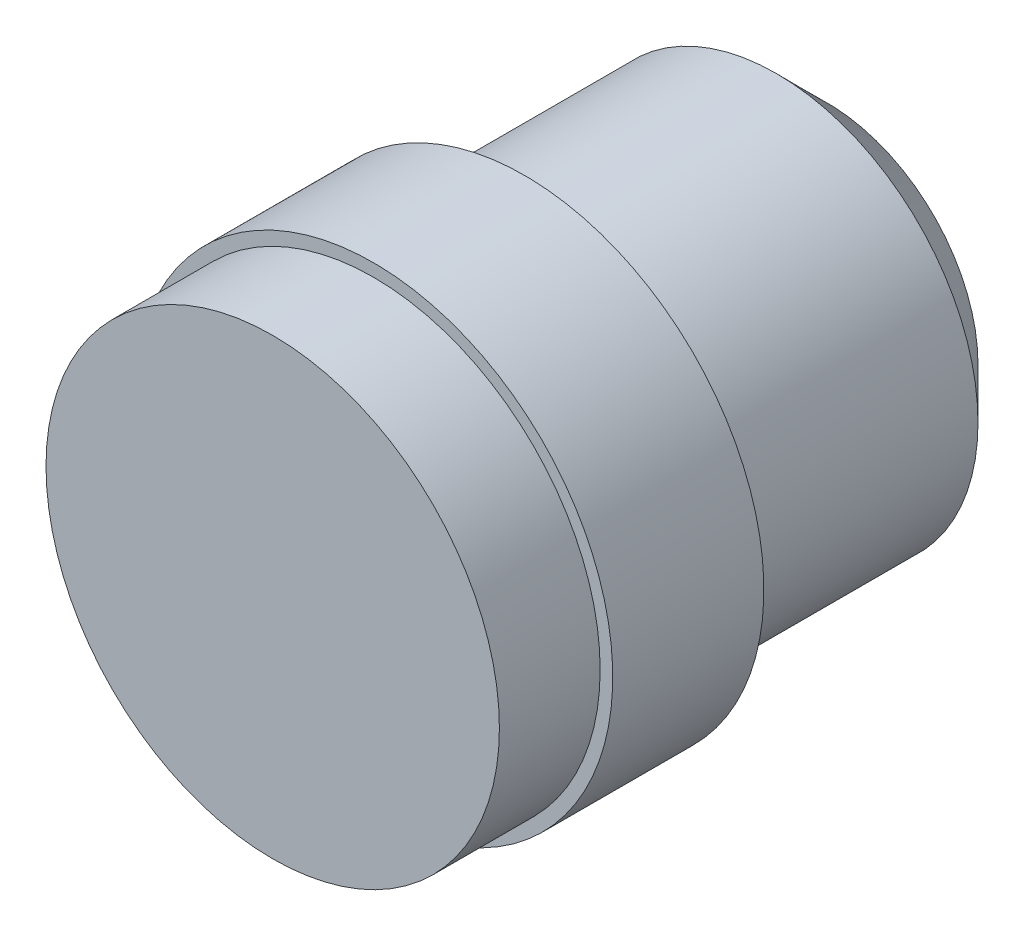
ISO-10303-21;
HEADER;
FILE_DESCRIPTION(('STEP AP214'),'2;1');
FILE_NAME('part.step','',(''),(''),'','','');
FILE_SCHEMA(('AUTOMOTIVE_DESIGN { 1 0 10303 214 1 1 1 1 }'));
ENDSEC;
DATA;
#1=APPLICATION_CONTEXT('core data for automotive mechanical design processes');
#2=APPLICATION_PROTOCOL_DEFINITION('international standard','automotive_design',2000,#1);
#3=PRODUCT_CONTEXT('',#1,'mechanical');
#4=PRODUCT('Part','Part','',(#3));
#5=PRODUCT_RELATED_PRODUCT_CATEGORY('part','',(#4));
#6=PRODUCT_DEFINITION_FORMATION('','',#4);
#7=PRODUCT_DEFINITION_CONTEXT('part definition',#1,'design');
#8=PRODUCT_DEFINITION('design','',#6,#7);
#9=PRODUCT_DEFINITION_SHAPE('','',#8);
#10=(LENGTH_UNIT() NAMED_UNIT(*) SI_UNIT(.MILLI.,.METRE.));
#11=(NAMED_UNIT(*) PLANE_ANGLE_UNIT() SI_UNIT($,.RADIAN.));
#12=(NAMED_UNIT(*) SI_UNIT($,.STERADIAN.) SOLID_ANGLE_UNIT());
#13=UNCERTAINTY_MEASURE_WITH_UNIT(LENGTH_MEASURE(1.E-05),#10,'distance_accuracy_value','');
#14=(GEOMETRIC_REPRESENTATION_CONTEXT(3) GLOBAL_UNCERTAINTY_ASSIGNED_CONTEXT((#13)) GLOBAL_UNIT_ASSIGNED_CONTEXT((#10,
#11,#12)) REPRESENTATION_CONTEXT('',''));
#15=CARTESIAN_POINT('',(0.,0.,0.));
#16=DIRECTION('',(0.,0.,1.));
#17=DIRECTION('',(1.,0.,0.));
#18=AXIS2_PLACEMENT_3D('',#15,#16,#17);
#19=CARTESIAN_POINT('',(0.,0.,6.));
#20=DIRECTION('',(0.,0.,1.));
#21=DIRECTION('',(1.,0.,0.));
#22=AXIS2_PLACEMENT_3D('',#19,#20,#21);
#23=PLANE('',#22);
#24=CARTESIAN_POINT('',(0.,0.,6.));
#25=DIRECTION('',(0.,0.,1.));
#26=DIRECTION('',(1.,0.,0.));
#27=AXIS2_PLACEMENT_3D('',#24,#25,#26);
#28=CIRCLE('',#27,4.);
#29=CARTESIAN_POINT('',(-4.,0.,6.));
#30=VERTEX_POINT('',#29);
#31=EDGE_CURVE('P0_E27',#30,#30,#28,.T.);
#32=ORIENTED_EDGE('',*,*,#31,.T.);
#33=EDGE_LOOP('',(#32));
#34=FACE_BOUND('',#33,.T.);
#35=ADVANCED_FACE('P0_F17',(#34),#23,.T.);
#36=CARTESIAN_POINT('',(0.,0.,0.));
#37=DIRECTION('',(0.,0.,1.));
#38=DIRECTION('',(1.,0.,0.));
#39=AXIS2_PLACEMENT_3D('',#36,#37,#38);
#40=PLANE('',#39);
#41=CARTESIAN_POINT('',(0.,0.,0.));
#42=DIRECTION('',(0.,0.,1.));
#43=DIRECTION('',(1.,0.,0.));
#44=AXIS2_PLACEMENT_3D('',#41,#42,#43);
#45=CIRCLE('',#44,3.);
#46=CARTESIAN_POINT('',(-3.,0.,0.));
#47=VERTEX_POINT('',#46);
#48=EDGE_CURVE('P0_E51',#47,#47,#45,.T.);
#49=ORIENTED_EDGE('',*,*,#48,.F.);
#50=EDGE_LOOP('',(#49));
#51=FACE_BOUND('',#50,.T.);
#52=ADVANCED_FACE('P0_F66',(#51),#40,.F.);
#53=CARTESIAN_POINT('',(0.,0.,0.));
#54=DIRECTION('',(0.,0.,1.));
#55=DIRECTION('',(1.,0.,0.));
#56=AXIS2_PLACEMENT_3D('',#53,#54,#55);
#57=CYLINDRICAL_SURFACE('',#56,4.);
#58=ORIENTED_EDGE('',*,*,#31,.F.);
#59=DIRECTION('',(0.,0.,-1.));
#60=VECTOR('',#59,1.);
#61=CARTESIAN_POINT('',(-4.,0.,0.));
#62=LINE('',#61,#60);
#63=CARTESIAN_POINT('',(-4.,0.,1.));
#64=VERTEX_POINT('',#63);
#65=EDGE_CURVE('P0_E11',#30,#64,#62,.T.);
#66=ORIENTED_EDGE('',*,*,#65,.T.);
#67=CARTESIAN_POINT('',(0.,0.,1.));
#68=DIRECTION('',(0.,0.,-1.));
#69=DIRECTION('',(1.,0.,0.));
#70=AXIS2_PLACEMENT_3D('',#67,#68,#69);
#71=CIRCLE('',#70,4.);
#72=EDGE_CURVE('P0_E44',#64,#64,#71,.T.);
#73=ORIENTED_EDGE('',*,*,#72,.F.);
#74=ORIENTED_EDGE('',*,*,#65,.F.);
#75=EDGE_LOOP('',(#58,#66,#73,#74));
#76=FACE_BOUND('',#75,.T.);
#77=ADVANCED_FACE('P0_F43',(#76),#57,.T.);
#78=CARTESIAN_POINT('',(0.,0.,0.5));
#79=DIRECTION('',(0.,0.,1.));
#80=DIRECTION('',(1.,0.,0.));
#81=AXIS2_PLACEMENT_3D('',#78,#79,#80);
#82=CONICAL_SURFACE('',#81,3.5,0.785398163397448);
#83=ORIENTED_EDGE('',*,*,#72,.T.);
#84=DIRECTION('',(0.707106781186547,0.,-0.707106781186548));
#85=VECTOR('',#84,1.);
#86=CARTESIAN_POINT('',(-3.5,0.,0.5));
#87=LINE('',#86,#85);
#88=EDGE_CURVE('P0_E48',#64,#47,#87,.T.);
#89=ORIENTED_EDGE('',*,*,#88,.T.);
#90=ORIENTED_EDGE('',*,*,#48,.T.);
#91=ORIENTED_EDGE('',*,*,#88,.F.);
#92=EDGE_LOOP('',(#83,#89,#90,#91));
#93=FACE_BOUND('',#92,.T.);
#94=ADVANCED_FACE('P0_F47',(#93),#82,.T.);
#95=CLOSED_SHELL('',(#35,#52,#77,#94));
#96=MANIFOLD_SOLID_BREP('P0_B1',#95);
#97=CARTESIAN_POINT('',(0.,0.,6.));
#98=DIRECTION('',(0.,0.,1.));
#99=DIRECTION('',(1.,0.,0.));
#100=AXIS2_PLACEMENT_3D('',#97,#98,#99);
#101=PLANE('',#100);
#102=CARTESIAN_POINT('',(0.,0.,6.));
#103=DIRECTION('',(0.,0.,1.));
#104=DIRECTION('',(1.,0.,0.));
#105=AXIS2_PLACEMENT_3D('',#102,#103,#104);
#106=CIRCLE('',#105,4.75);
#107=CARTESIAN_POINT('',(-4.75,0.,6.));
#108=VERTEX_POINT('',#107);
#109=EDGE_CURVE('P1_E10',#108,#108,#106,.T.);
#110=ORIENTED_EDGE('',*,*,#109,.F.);
#111=EDGE_LOOP('',(#110));
#112=FACE_BOUND('',#111,.T.);
#113=ADVANCED_FACE('P1_F16',(#112),#101,.F.);
#114=CARTESIAN_POINT('',(0.,0.,9.));
#115=DIRECTION('',(0.,0.,1.));
#116=DIRECTION('',(1.,0.,0.));
#117=AXIS2_PLACEMENT_3D('',#114,#115,#116);
#118=PLANE('',#117);
#119=CARTESIAN_POINT('',(0.,0.,9.));
#120=DIRECTION('',(0.,0.,-1.));
#121=DIRECTION('',(1.,0.,0.));
#122=AXIS2_PLACEMENT_3D('',#119,#120,#121);
#123=CIRCLE('',#122,4.5);
#124=CARTESIAN_POINT('',(-4.5,0.,9.));
#125=VERTEX_POINT('',#124);
#126=EDGE_CURVE('P1_E46',#125,#125,#123,.T.);
#127=ORIENTED_EDGE('',*,*,#126,.T.);
#128=EDGE_LOOP('',(#127));
#129=FACE_BOUND('',#128,.T.);
#130=CARTESIAN_POINT('',(0.,0.,9.));
#131=DIRECTION('',(0.,0.,1.));
#132=DIRECTION('',(1.,0.,0.));
#133=AXIS2_PLACEMENT_3D('',#130,#131,#132);
#134=CIRCLE('',#133,4.75);
#135=CARTESIAN_POINT('',(-4.75,0.,9.));
#136=VERTEX_POINT('',#135);
#137=EDGE_CURVE('P1_E55',#136,#136,#134,.T.);
#138=ORIENTED_EDGE('',*,*,#137,.T.);
#139=EDGE_LOOP('',(#138));
#140=FACE_BOUND('',#139,.T.);
#141=ADVANCED_FACE('P1_F50',(#129,#140),#118,.T.);
#142=CARTESIAN_POINT('',(0.,0.,6.));
#143=DIRECTION('',(0.,0.,1.));
#144=DIRECTION('',(1.,0.,0.));
#145=AXIS2_PLACEMENT_3D('',#142,#143,#144);
#146=CYLINDRICAL_SURFACE('',#145,4.75);
#147=ORIENTED_EDGE('',*,*,#137,.F.);
#148=DIRECTION('',(0.,0.,-1.));
#149=VECTOR('',#148,1.);
#150=CARTESIAN_POINT('',(-4.75,0.,6.));
#151=LINE('',#150,#149);
#152=EDGE_CURVE('P1_E25',#136,#108,#151,.T.);
#153=ORIENTED_EDGE('',*,*,#152,.T.);
#154=ORIENTED_EDGE('',*,*,#109,.T.);
#155=ORIENTED_EDGE('',*,*,#152,.F.);
#156=EDGE_LOOP('',(#147,#153,#154,#155));
#157=FACE_BOUND('',#156,.T.);
#158=ADVANCED_FACE('P1_F67',(#157),#146,.T.);
#159=CARTESIAN_POINT('',(0.,0.,11.));
#160=DIRECTION('',(0.,0.,1.));
#161=DIRECTION('',(1.,0.,0.));
#162=AXIS2_PLACEMENT_3D('',#159,#160,#161);
#163=PLANE('',#162);
#164=CARTESIAN_POINT('',(0.,0.,11.));
#165=DIRECTION('',(0.,0.,1.));
#166=DIRECTION('',(1.,0.,0.));
#167=AXIS2_PLACEMENT_3D('',#164,#165,#166);
#168=CIRCLE('',#167,4.5);
#169=CARTESIAN_POINT('',(-4.5,0.,11.));
#170=VERTEX_POINT('',#169);
#171=EDGE_CURVE('P1_E62',#170,#170,#168,.T.);
#172=ORIENTED_EDGE('',*,*,#171,.T.);
#173=EDGE_LOOP('',(#172));
#174=FACE_BOUND('',#173,.T.);
#175=ADVANCED_FACE('P1_F76',(#174),#163,.T.);
#176=CARTESIAN_POINT('',(0.,0.,9.));
#177=DIRECTION('',(0.,0.,1.));
#178=DIRECTION('',(1.,0.,0.));
#179=AXIS2_PLACEMENT_3D('',#176,#177,#178);
#180=CYLINDRICAL_SURFACE('',#179,4.5);
#181=ORIENTED_EDGE('',*,*,#171,.F.);
#182=DIRECTION('',(0.,0.,-1.));
#183=VECTOR('',#182,1.);
#184=CARTESIAN_POINT('',(-4.5,0.,9.));
#185=LINE('',#184,#183);
#186=EDGE_CURVE('P1_E52',#170,#125,#185,.T.);
#187=ORIENTED_EDGE('',*,*,#186,.T.);
#188=ORIENTED_EDGE('',*,*,#126,.F.);
#189=ORIENTED_EDGE('',*,*,#186,.F.);
#190=EDGE_LOOP('',(#181,#187,#188,#189));
#191=FACE_BOUND('',#190,.T.);
#192=ADVANCED_FACE('P1_F85',(#191),#180,.T.);
#193=CLOSED_SHELL('',(#113,#141,#158,#175,#192));
#194=MANIFOLD_SOLID_BREP('P1_B1',#193);
#195=ADVANCED_BREP_SHAPE_REPRESENTATION('',(#18,#96,#194),#14);
#196=SHAPE_DEFINITION_REPRESENTATION(#9,#195);
ENDSEC;
END-ISO-10303-21;
